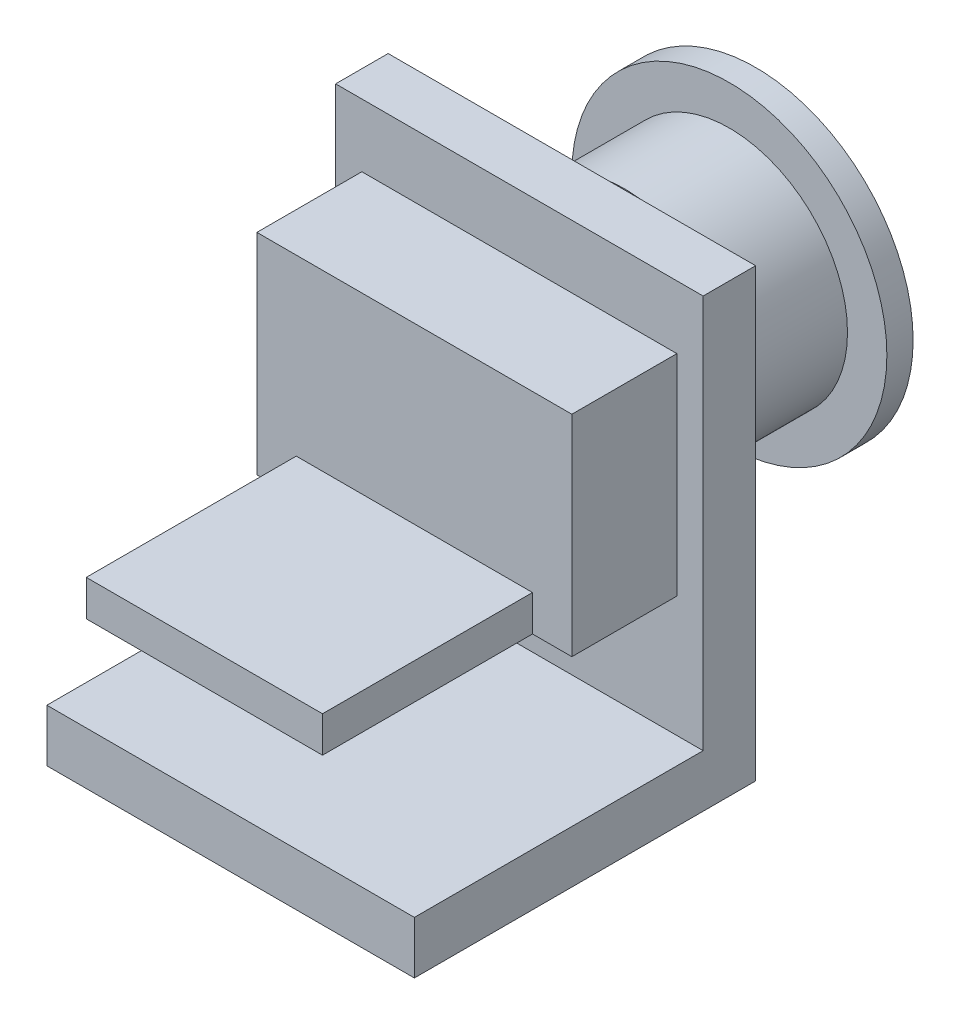
ISO-10303-21;
HEADER;
FILE_DESCRIPTION(('STEP AP214'),'2;1');
FILE_NAME('part.step','',(''),(''),'','','');
FILE_SCHEMA(('AUTOMOTIVE_DESIGN { 1 0 10303 214 1 1 1 1 }'));
ENDSEC;
DATA;
#1=APPLICATION_CONTEXT('core data for automotive mechanical design processes');
#2=APPLICATION_PROTOCOL_DEFINITION('international standard','automotive_design',2000,#1);
#3=PRODUCT_CONTEXT('',#1,'mechanical');
#4=PRODUCT('Part','Part','',(#3));
#5=PRODUCT_RELATED_PRODUCT_CATEGORY('part','',(#4));
#6=PRODUCT_DEFINITION_FORMATION('','',#4);
#7=PRODUCT_DEFINITION_CONTEXT('part definition',#1,'design');
#8=PRODUCT_DEFINITION('design','',#6,#7);
#9=PRODUCT_DEFINITION_SHAPE('','',#8);
#10=(LENGTH_UNIT() NAMED_UNIT(*) SI_UNIT(.MILLI.,.METRE.));
#11=(NAMED_UNIT(*) PLANE_ANGLE_UNIT() SI_UNIT($,.RADIAN.));
#12=(NAMED_UNIT(*) SI_UNIT($,.STERADIAN.) SOLID_ANGLE_UNIT());
#13=UNCERTAINTY_MEASURE_WITH_UNIT(LENGTH_MEASURE(1.E-05),#10,'distance_accuracy_value','');
#14=(GEOMETRIC_REPRESENTATION_CONTEXT(3) GLOBAL_UNCERTAINTY_ASSIGNED_CONTEXT((#13)) GLOBAL_UNIT_ASSIGNED_CONTEXT((#10,
#11,#12)) REPRESENTATION_CONTEXT('',''));
#15=CARTESIAN_POINT('',(0.,0.,0.));
#16=DIRECTION('',(0.,0.,1.));
#17=DIRECTION('',(1.,0.,0.));
#18=AXIS2_PLACEMENT_3D('',#15,#16,#17);
#19=CARTESIAN_POINT('',(0.,0.,41.275));
#20=DIRECTION('',(0.,0.,-1.));
#21=DIRECTION('',(-1.,0.,0.));
#22=AXIS2_PLACEMENT_3D('',#19,#20,#21);
#23=PLANE('',#22);
#24=DIRECTION('',(0.,-1.,0.));
#25=VECTOR('',#24,1.);
#26=CARTESIAN_POINT('',(-14.2875,-12.5187732823241,41.275));
#27=LINE('',#26,#25);
#28=CARTESIAN_POINT('',(-14.2875,-8.17563926273846,41.275));
#29=VERTEX_POINT('',#28);
#30=CARTESIAN_POINT('',(-14.2875,-12.5187732823241,41.275));
#31=VERTEX_POINT('',#30);
#32=EDGE_CURVE('E52',#29,#31,#27,.T.);
#33=ORIENTED_EDGE('',*,*,#32,.F.);
#34=DIRECTION('',(-1.,0.,0.));
#35=VECTOR('',#34,1.);
#36=CARTESIAN_POINT('',(-14.2875,-8.17563926273846,41.275));
#37=LINE('',#36,#35);
#38=CARTESIAN_POINT('',(14.2875,-8.17563926273846,41.275));
#39=VERTEX_POINT('',#38);
#40=EDGE_CURVE('E157',#39,#29,#37,.T.);
#41=ORIENTED_EDGE('',*,*,#40,.F.);
#42=DIRECTION('',(0.,1.,0.));
#43=VECTOR('',#42,1.);
#44=CARTESIAN_POINT('',(14.2875,-8.17563926273846,41.275));
#45=LINE('',#44,#43);
#46=CARTESIAN_POINT('',(14.2875,-12.5187732823241,41.275));
#47=VERTEX_POINT('',#46);
#48=EDGE_CURVE('E58',#47,#39,#45,.T.);
#49=ORIENTED_EDGE('',*,*,#48,.F.);
#50=DIRECTION('',(1.,0.,0.));
#51=VECTOR('',#50,1.);
#52=CARTESIAN_POINT('',(19.05,-12.5187732823241,41.275));
#53=LINE('',#52,#51);
#54=CARTESIAN_POINT('',(19.05,-12.5187732823241,41.275));
#55=VERTEX_POINT('',#54);
#56=EDGE_CURVE('E172',#47,#55,#53,.T.);
#57=ORIENTED_EDGE('',*,*,#56,.T.);
#58=DIRECTION('',(0.,1.,0.));
#59=VECTOR('',#58,1.);
#60=CARTESIAN_POINT('',(19.05,12.8812267176759,41.275));
#61=LINE('',#60,#59);
#62=CARTESIAN_POINT('',(19.05,12.8812267176759,41.275));
#63=VERTEX_POINT('',#62);
#64=EDGE_CURVE('E176',#55,#63,#61,.T.);
#65=ORIENTED_EDGE('',*,*,#64,.T.);
#66=DIRECTION('',(-1.,0.,0.));
#67=VECTOR('',#66,1.);
#68=CARTESIAN_POINT('',(-19.05,12.8812267176759,41.275));
#69=LINE('',#68,#67);
#70=CARTESIAN_POINT('',(-19.05,12.8812267176759,41.275));
#71=VERTEX_POINT('',#70);
#72=EDGE_CURVE('E178',#63,#71,#69,.T.);
#73=ORIENTED_EDGE('',*,*,#72,.T.);
#74=DIRECTION('',(0.,-1.,0.));
#75=VECTOR('',#74,1.);
#76=CARTESIAN_POINT('',(-19.05,-12.5187732823241,41.275));
#77=LINE('',#76,#75);
#78=CARTESIAN_POINT('',(-19.05,-12.5187732823241,41.275));
#79=VERTEX_POINT('',#78);
#80=EDGE_CURVE('E169',#71,#79,#77,.T.);
#81=ORIENTED_EDGE('',*,*,#80,.T.);
#82=EDGE_CURVE('E174',#79,#31,#53,.T.);
#83=ORIENTED_EDGE('',*,*,#82,.T.);
#84=EDGE_LOOP('',(#33,#41,#49,#57,#65,#73,#81,#83));
#85=FACE_BOUND('',#84,.T.);
#86=ADVANCED_FACE('F35',(#85),#23,.F.);
#87=CARTESIAN_POINT('',(0.,0.,28.575));
#88=DIRECTION('',(0.,0.,-1.));
#89=DIRECTION('',(-1.,0.,0.));
#90=AXIS2_PLACEMENT_3D('',#87,#88,#89);
#91=PLANE('',#90);
#92=DIRECTION('',(-1.,0.,0.));
#93=VECTOR('',#92,1.);
#94=CARTESIAN_POINT('',(-22.225,-27.1237732823241,28.575));
#95=LINE('',#94,#93);
#96=CARTESIAN_POINT('',(22.225,-27.1237732823241,28.575));
#97=VERTEX_POINT('',#96);
#98=CARTESIAN_POINT('',(-22.225,-27.1237732823241,28.575));
#99=VERTEX_POINT('',#98);
#100=EDGE_CURVE('E198',#97,#99,#95,.T.);
#101=ORIENTED_EDGE('',*,*,#100,.F.);
#102=DIRECTION('',(0.,1.,0.));
#103=VECTOR('',#102,1.);
#104=CARTESIAN_POINT('',(22.225,20.5012267176759,28.575));
#105=LINE('',#104,#103);
#106=CARTESIAN_POINT('',(22.225,20.5012267176759,28.575));
#107=VERTEX_POINT('',#106);
#108=EDGE_CURVE('E220',#97,#107,#105,.T.);
#109=ORIENTED_EDGE('',*,*,#108,.T.);
#110=DIRECTION('',(-1.,0.,0.));
#111=VECTOR('',#110,1.);
#112=CARTESIAN_POINT('',(-22.225,20.5012267176759,28.575));
#113=LINE('',#112,#111);
#114=CARTESIAN_POINT('',(-22.225,20.5012267176759,28.575));
#115=VERTEX_POINT('',#114);
#116=EDGE_CURVE('E223',#107,#115,#113,.T.);
#117=ORIENTED_EDGE('',*,*,#116,.T.);
#118=DIRECTION('',(0.,-1.,0.));
#119=VECTOR('',#118,1.);
#120=CARTESIAN_POINT('',(-22.225,-33.4737732823241,28.575));
#121=LINE('',#120,#119);
#122=EDGE_CURVE('E218',#115,#99,#121,.T.);
#123=ORIENTED_EDGE('',*,*,#122,.T.);
#124=EDGE_LOOP('',(#101,#109,#117,#123));
#125=FACE_BOUND('',#124,.T.);
#126=DIRECTION('',(0.,-1.,0.));
#127=VECTOR('',#126,1.);
#128=CARTESIAN_POINT('',(-19.05,-12.5187732823241,28.575));
#129=LINE('',#128,#127);
#130=CARTESIAN_POINT('',(-19.05,12.8812267176759,28.575));
#131=VERTEX_POINT('',#130);
#132=CARTESIAN_POINT('',(-19.05,-12.5187732823241,28.575));
#133=VERTEX_POINT('',#132);
#134=EDGE_CURVE('E160',#131,#133,#129,.T.);
#135=ORIENTED_EDGE('',*,*,#134,.F.);
#136=DIRECTION('',(-1.,0.,0.));
#137=VECTOR('',#136,1.);
#138=CARTESIAN_POINT('',(-19.05,12.8812267176759,28.575));
#139=LINE('',#138,#137);
#140=CARTESIAN_POINT('',(19.05,12.8812267176759,28.575));
#141=VERTEX_POINT('',#140);
#142=EDGE_CURVE('E173',#141,#131,#139,.T.);
#143=ORIENTED_EDGE('',*,*,#142,.F.);
#144=DIRECTION('',(0.,1.,0.));
#145=VECTOR('',#144,1.);
#146=CARTESIAN_POINT('',(19.05,12.8812267176759,28.575));
#147=LINE('',#146,#145);
#148=CARTESIAN_POINT('',(19.05,-12.5187732823241,28.575));
#149=VERTEX_POINT('',#148);
#150=EDGE_CURVE('E182',#149,#141,#147,.T.);
#151=ORIENTED_EDGE('',*,*,#150,.F.);
#152=DIRECTION('',(1.,0.,0.));
#153=VECTOR('',#152,1.);
#154=CARTESIAN_POINT('',(19.05,-12.5187732823241,28.575));
#155=LINE('',#154,#153);
#156=EDGE_CURVE('E163',#133,#149,#155,.T.);
#157=ORIENTED_EDGE('',*,*,#156,.F.);
#158=EDGE_LOOP('',(#135,#143,#151,#157));
#159=FACE_BOUND('',#158,.T.);
#160=ADVANCED_FACE('F273',(#125,#159),#91,.F.);
#161=CARTESIAN_POINT('',(0.,0.,3.175));
#162=DIRECTION('',(0.,0.,-1.));
#163=DIRECTION('',(-1.,0.,0.));
#164=AXIS2_PLACEMENT_3D('',#161,#162,#163);
#165=CYLINDRICAL_SURFACE('',#164,19.05);
#166=CARTESIAN_POINT('',(0.,0.,3.175));
#167=DIRECTION('',(0.,0.,1.));
#168=DIRECTION('',(1.,0.,0.));
#169=AXIS2_PLACEMENT_3D('',#166,#167,#168);
#170=CIRCLE('',#169,19.05);
#171=CARTESIAN_POINT('',(19.05,0.,3.175));
#172=VERTEX_POINT('',#171);
#173=EDGE_CURVE('E251',#172,#172,#170,.T.);
#174=ORIENTED_EDGE('',*,*,#173,.F.);
#175=EDGE_LOOP('',(#174));
#176=FACE_BOUND('',#175,.T.);
#177=CARTESIAN_POINT('',(0.,0.,0.));
#178=DIRECTION('',(0.,0.,1.));
#179=DIRECTION('',(1.,0.,0.));
#180=AXIS2_PLACEMENT_3D('',#177,#178,#179);
#181=CIRCLE('',#180,19.05);
#182=CARTESIAN_POINT('',(19.05,0.,0.));
#183=VERTEX_POINT('',#182);
#184=EDGE_CURVE('E39',#183,#183,#181,.T.);
#185=ORIENTED_EDGE('',*,*,#184,.T.);
#186=EDGE_LOOP('',(#185));
#187=FACE_BOUND('',#186,.T.);
#188=ADVANCED_FACE('F37',(#176,#187),#165,.T.);
#189=CARTESIAN_POINT('',(0.,0.,3.175));
#190=DIRECTION('',(0.,0.,1.));
#191=DIRECTION('',(1.,0.,0.));
#192=AXIS2_PLACEMENT_3D('',#189,#190,#191);
#193=PLANE('',#192);
#194=CARTESIAN_POINT('',(0.,0.,3.175));
#195=DIRECTION('',(0.,0.,1.));
#196=DIRECTION('',(1.,0.,0.));
#197=AXIS2_PLACEMENT_3D('',#194,#195,#196);
#198=CIRCLE('',#197,14.2875);
#199=CARTESIAN_POINT('',(14.2875,0.,3.175));
#200=VERTEX_POINT('',#199);
#201=EDGE_CURVE('E44',#200,#200,#198,.T.);
#202=ORIENTED_EDGE('',*,*,#201,.F.);
#203=EDGE_LOOP('',(#202));
#204=FACE_BOUND('',#203,.T.);
#205=ORIENTED_EDGE('',*,*,#173,.T.);
#206=EDGE_LOOP('',(#205));
#207=FACE_BOUND('',#206,.T.);
#208=ADVANCED_FACE('F262',(#204,#207),#193,.T.);
#209=CARTESIAN_POINT('',(0.,0.,0.));
#210=DIRECTION('',(0.,0.,1.));
#211=DIRECTION('',(1.,0.,0.));
#212=AXIS2_PLACEMENT_3D('',#209,#210,#211);
#213=PLANE('',#212);
#214=ORIENTED_EDGE('',*,*,#184,.F.);
#215=EDGE_LOOP('',(#214));
#216=FACE_BOUND('',#215,.T.);
#217=ADVANCED_FACE('F259',(#216),#213,.F.);
#218=CARTESIAN_POINT('',(0.,0.,15.875));
#219=DIRECTION('',(0.,0.,-1.));
#220=DIRECTION('',(-1.,0.,0.));
#221=AXIS2_PLACEMENT_3D('',#218,#219,#220);
#222=CYLINDRICAL_SURFACE('',#221,14.2875);
#223=CARTESIAN_POINT('',(0.,0.,15.875));
#224=DIRECTION('',(0.,0.,1.));
#225=DIRECTION('',(1.,0.,0.));
#226=AXIS2_PLACEMENT_3D('',#223,#224,#225);
#227=CIRCLE('',#226,14.2875);
#228=CARTESIAN_POINT('',(14.2875,0.,15.875));
#229=VERTEX_POINT('',#228);
#230=EDGE_CURVE('E246',#229,#229,#227,.T.);
#231=ORIENTED_EDGE('',*,*,#230,.F.);
#232=EDGE_LOOP('',(#231));
#233=FACE_BOUND('',#232,.T.);
#234=ORIENTED_EDGE('',*,*,#201,.T.);
#235=EDGE_LOOP('',(#234));
#236=FACE_BOUND('',#235,.T.);
#237=ADVANCED_FACE('F261',(#233,#236),#222,.T.);
#238=CARTESIAN_POINT('',(0.,0.,15.875));
#239=DIRECTION('',(0.,0.,1.));
#240=DIRECTION('',(1.,0.,0.));
#241=AXIS2_PLACEMENT_3D('',#238,#239,#240);
#242=PLANE('',#241);
#243=CARTESIAN_POINT('',(0.,0.,15.875));
#244=DIRECTION('',(0.,0.,1.));
#245=DIRECTION('',(1.,0.,0.));
#246=AXIS2_PLACEMENT_3D('',#243,#244,#245);
#247=CIRCLE('',#246,12.7);
#248=CARTESIAN_POINT('',(12.7,0.,15.875));
#249=VERTEX_POINT('',#248);
#250=EDGE_CURVE('E11',#249,#249,#247,.T.);
#251=ORIENTED_EDGE('',*,*,#250,.F.);
#252=EDGE_LOOP('',(#251));
#253=FACE_BOUND('',#252,.T.);
#254=ORIENTED_EDGE('',*,*,#230,.T.);
#255=EDGE_LOOP('',(#254));
#256=FACE_BOUND('',#255,.T.);
#257=ADVANCED_FACE('F267',(#253,#256),#242,.T.);
#258=CARTESIAN_POINT('',(0.,0.,22.225));
#259=DIRECTION('',(0.,0.,-1.));
#260=DIRECTION('',(-1.,0.,0.));
#261=AXIS2_PLACEMENT_3D('',#258,#259,#260);
#262=CYLINDRICAL_SURFACE('',#261,12.7);
#263=CARTESIAN_POINT('',(0.,0.,22.225));
#264=DIRECTION('',(0.,0.,1.));
#265=DIRECTION('',(1.,0.,0.));
#266=AXIS2_PLACEMENT_3D('',#263,#264,#265);
#267=CIRCLE('',#266,12.7);
#268=CARTESIAN_POINT('',(12.7,0.,22.225));
#269=VERTEX_POINT('',#268);
#270=EDGE_CURVE('E244',#269,#269,#267,.T.);
#271=ORIENTED_EDGE('',*,*,#270,.F.);
#272=EDGE_LOOP('',(#271));
#273=FACE_BOUND('',#272,.T.);
#274=ORIENTED_EDGE('',*,*,#250,.T.);
#275=EDGE_LOOP('',(#274));
#276=FACE_BOUND('',#275,.T.);
#277=ADVANCED_FACE('F324',(#273,#276),#262,.T.);
#278=CARTESIAN_POINT('',(-22.225,-33.4737732823241,28.575));
#279=DIRECTION('',(1.,0.,0.));
#280=DIRECTION('',(0.,1.,0.));
#281=AXIS2_PLACEMENT_3D('',#278,#279,#280);
#282=PLANE('',#281);
#283=DIRECTION('',(0.,-1.,0.));
#284=VECTOR('',#283,1.);
#285=CARTESIAN_POINT('',(-22.225,-33.4737732823241,22.225));
#286=LINE('',#285,#284);
#287=CARTESIAN_POINT('',(-22.225,20.5012267176759,22.225));
#288=VERTEX_POINT('',#287);
#289=CARTESIAN_POINT('',(-22.225,-33.4737732823241,22.225));
#290=VERTEX_POINT('',#289);
#291=EDGE_CURVE('E217',#288,#290,#286,.T.);
#292=ORIENTED_EDGE('',*,*,#291,.T.);
#293=DIRECTION('',(0.,0.,-1.));
#294=VECTOR('',#293,1.);
#295=CARTESIAN_POINT('',(-22.225,-33.4737732823241,28.575));
#296=LINE('',#295,#294);
#297=CARTESIAN_POINT('',(-22.225,-33.4737732823241,63.5));
#298=VERTEX_POINT('',#297);
#299=EDGE_CURVE('E241',#298,#290,#296,.T.);
#300=ORIENTED_EDGE('',*,*,#299,.F.);
#301=DIRECTION('',(0.,-1.,0.));
#302=VECTOR('',#301,1.);
#303=CARTESIAN_POINT('',(-22.225,-33.4737732823241,63.5));
#304=LINE('',#303,#302);
#305=CARTESIAN_POINT('',(-22.225,-27.1237732823241,63.5));
#306=VERTEX_POINT('',#305);
#307=EDGE_CURVE('E199',#306,#298,#304,.T.);
#308=ORIENTED_EDGE('',*,*,#307,.F.);
#309=DIRECTION('',(0.,0.,-1.));
#310=VECTOR('',#309,1.);
#311=CARTESIAN_POINT('',(-22.225,-27.1237732823241,63.5));
#312=LINE('',#311,#310);
#313=EDGE_CURVE('E209',#306,#99,#312,.T.);
#314=ORIENTED_EDGE('',*,*,#313,.T.);
#315=ORIENTED_EDGE('',*,*,#122,.F.);
#316=DIRECTION('',(0.,0.,-1.));
#317=VECTOR('',#316,1.);
#318=CARTESIAN_POINT('',(-22.225,20.5012267176759,28.575));
#319=LINE('',#318,#317);
#320=EDGE_CURVE('E225',#115,#288,#319,.T.);
#321=ORIENTED_EDGE('',*,*,#320,.T.);
#322=EDGE_LOOP('',(#292,#300,#308,#314,#315,#321));
#323=FACE_BOUND('',#322,.T.);
#324=ADVANCED_FACE('F320',(#323),#282,.F.);
#325=CARTESIAN_POINT('',(22.225,-33.4737732823241,28.575));
#326=DIRECTION('',(0.,1.,0.));
#327=DIRECTION('',(0.,0.,1.));
#328=AXIS2_PLACEMENT_3D('',#325,#326,#327);
#329=PLANE('',#328);
#330=DIRECTION('',(1.,0.,0.));
#331=VECTOR('',#330,1.);
#332=CARTESIAN_POINT('',(22.225,-33.4737732823241,22.225));
#333=LINE('',#332,#331);
#334=CARTESIAN_POINT('',(22.225,-33.4737732823241,22.225));
#335=VERTEX_POINT('',#334);
#336=EDGE_CURVE('E228',#290,#335,#333,.T.);
#337=ORIENTED_EDGE('',*,*,#336,.T.);
#338=DIRECTION('',(0.,0.,-1.));
#339=VECTOR('',#338,1.);
#340=CARTESIAN_POINT('',(22.225,-33.4737732823241,28.575));
#341=LINE('',#340,#339);
#342=CARTESIAN_POINT('',(22.225,-33.4737732823241,63.5));
#343=VERTEX_POINT('',#342);
#344=EDGE_CURVE('E238',#343,#335,#341,.T.);
#345=ORIENTED_EDGE('',*,*,#344,.F.);
#346=DIRECTION('',(1.,0.,0.));
#347=VECTOR('',#346,1.);
#348=CARTESIAN_POINT('',(22.225,-33.4737732823241,63.5));
#349=LINE('',#348,#347);
#350=EDGE_CURVE('E202',#298,#343,#349,.T.);
#351=ORIENTED_EDGE('',*,*,#350,.F.);
#352=ORIENTED_EDGE('',*,*,#299,.T.);
#353=EDGE_LOOP('',(#337,#345,#351,#352));
#354=FACE_BOUND('',#353,.T.);
#355=ADVANCED_FACE('F316',(#354),#329,.F.);
#356=CARTESIAN_POINT('',(22.225,20.5012267176759,28.575));
#357=DIRECTION('',(-1.,0.,0.));
#358=DIRECTION('',(0.,-1.,0.));
#359=AXIS2_PLACEMENT_3D('',#356,#357,#358);
#360=PLANE('',#359);
#361=DIRECTION('',(0.,1.,0.));
#362=VECTOR('',#361,1.);
#363=CARTESIAN_POINT('',(22.225,20.5012267176759,22.225));
#364=LINE('',#363,#362);
#365=CARTESIAN_POINT('',(22.225,20.5012267176759,22.225));
#366=VERTEX_POINT('',#365);
#367=EDGE_CURVE('E230',#335,#366,#364,.T.);
#368=ORIENTED_EDGE('',*,*,#367,.T.);
#369=DIRECTION('',(0.,0.,-1.));
#370=VECTOR('',#369,1.);
#371=CARTESIAN_POINT('',(22.225,20.5012267176759,28.575));
#372=LINE('',#371,#370);
#373=EDGE_CURVE('E235',#107,#366,#372,.T.);
#374=ORIENTED_EDGE('',*,*,#373,.F.);
#375=ORIENTED_EDGE('',*,*,#108,.F.);
#376=DIRECTION('',(0.,0.,-1.));
#377=VECTOR('',#376,1.);
#378=CARTESIAN_POINT('',(22.225,-27.1237732823241,63.5));
#379=LINE('',#378,#377);
#380=CARTESIAN_POINT('',(22.225,-27.1237732823241,63.5));
#381=VERTEX_POINT('',#380);
#382=EDGE_CURVE('E214',#381,#97,#379,.T.);
#383=ORIENTED_EDGE('',*,*,#382,.F.);
#384=DIRECTION('',(0.,1.,0.));
#385=VECTOR('',#384,1.);
#386=CARTESIAN_POINT('',(22.225,-27.1237732823241,63.5));
#387=LINE('',#386,#385);
#388=EDGE_CURVE('E205',#343,#381,#387,.T.);
#389=ORIENTED_EDGE('',*,*,#388,.F.);
#390=ORIENTED_EDGE('',*,*,#344,.T.);
#391=EDGE_LOOP('',(#368,#374,#375,#383,#389,#390));
#392=FACE_BOUND('',#391,.T.);
#393=ADVANCED_FACE('F312',(#392),#360,.F.);
#394=CARTESIAN_POINT('',(-22.225,20.5012267176759,28.575));
#395=DIRECTION('',(0.,-1.,0.));
#396=DIRECTION('',(0.,0.,-1.));
#397=AXIS2_PLACEMENT_3D('',#394,#395,#396);
#398=PLANE('',#397);
#399=DIRECTION('',(-1.,0.,0.));
#400=VECTOR('',#399,1.);
#401=CARTESIAN_POINT('',(-22.225,20.5012267176759,22.225));
#402=LINE('',#401,#400);
#403=EDGE_CURVE('E221',#366,#288,#402,.T.);
#404=ORIENTED_EDGE('',*,*,#403,.T.);
#405=ORIENTED_EDGE('',*,*,#320,.F.);
#406=ORIENTED_EDGE('',*,*,#116,.F.);
#407=ORIENTED_EDGE('',*,*,#373,.T.);
#408=EDGE_LOOP('',(#404,#405,#406,#407));
#409=FACE_BOUND('',#408,.T.);
#410=ADVANCED_FACE('F308',(#409),#398,.F.);
#411=CARTESIAN_POINT('',(0.,0.,22.225));
#412=DIRECTION('',(0.,0.,-1.));
#413=DIRECTION('',(-1.,0.,0.));
#414=AXIS2_PLACEMENT_3D('',#411,#412,#413);
#415=PLANE('',#414);
#416=ORIENTED_EDGE('',*,*,#270,.T.);
#417=EDGE_LOOP('',(#416));
#418=FACE_BOUND('',#417,.T.);
#419=ORIENTED_EDGE('',*,*,#291,.F.);
#420=ORIENTED_EDGE('',*,*,#403,.F.);
#421=ORIENTED_EDGE('',*,*,#367,.F.);
#422=ORIENTED_EDGE('',*,*,#336,.F.);
#423=EDGE_LOOP('',(#419,#420,#421,#422));
#424=FACE_BOUND('',#423,.T.);
#425=ADVANCED_FACE('F303',(#418,#424),#415,.T.);
#426=CARTESIAN_POINT('',(-22.225,-27.1237732823241,63.5));
#427=DIRECTION('',(0.,-1.,0.));
#428=DIRECTION('',(0.,0.,-1.));
#429=AXIS2_PLACEMENT_3D('',#426,#427,#428);
#430=PLANE('',#429);
#431=ORIENTED_EDGE('',*,*,#100,.T.);
#432=ORIENTED_EDGE('',*,*,#313,.F.);
#433=DIRECTION('',(-1.,0.,0.));
#434=VECTOR('',#433,1.);
#435=CARTESIAN_POINT('',(-22.225,-27.1237732823241,63.5));
#436=LINE('',#435,#434);
#437=EDGE_CURVE('E207',#381,#306,#436,.T.);
#438=ORIENTED_EDGE('',*,*,#437,.F.);
#439=ORIENTED_EDGE('',*,*,#382,.T.);
#440=EDGE_LOOP('',(#431,#432,#438,#439));
#441=FACE_BOUND('',#440,.T.);
#442=ADVANCED_FACE('F300',(#441),#430,.F.);
#443=CARTESIAN_POINT('',(0.,0.,63.5));
#444=DIRECTION('',(0.,0.,-1.));
#445=DIRECTION('',(-1.,0.,0.));
#446=AXIS2_PLACEMENT_3D('',#443,#444,#445);
#447=PLANE('',#446);
#448=ORIENTED_EDGE('',*,*,#307,.T.);
#449=ORIENTED_EDGE('',*,*,#350,.T.);
#450=ORIENTED_EDGE('',*,*,#388,.T.);
#451=ORIENTED_EDGE('',*,*,#437,.T.);
#452=EDGE_LOOP('',(#448,#449,#450,#451));
#453=FACE_BOUND('',#452,.T.);
#454=ADVANCED_FACE('F296',(#453),#447,.F.);
#455=CARTESIAN_POINT('',(-19.05,-12.5187732823241,41.275));
#456=DIRECTION('',(1.,0.,0.));
#457=DIRECTION('',(0.,1.,0.));
#458=AXIS2_PLACEMENT_3D('',#455,#456,#457);
#459=PLANE('',#458);
#460=ORIENTED_EDGE('',*,*,#134,.T.);
#461=DIRECTION('',(0.,0.,-1.));
#462=VECTOR('',#461,1.);
#463=CARTESIAN_POINT('',(-19.05,-12.5187732823241,41.275));
#464=LINE('',#463,#462);
#465=EDGE_CURVE('E195',#79,#133,#464,.T.);
#466=ORIENTED_EDGE('',*,*,#465,.F.);
#467=ORIENTED_EDGE('',*,*,#80,.F.);
#468=DIRECTION('',(0.,0.,-1.));
#469=VECTOR('',#468,1.);
#470=CARTESIAN_POINT('',(-19.05,12.8812267176759,41.275));
#471=LINE('',#470,#469);
#472=EDGE_CURVE('E179',#71,#131,#471,.T.);
#473=ORIENTED_EDGE('',*,*,#472,.T.);
#474=EDGE_LOOP('',(#460,#466,#467,#473));
#475=FACE_BOUND('',#474,.T.);
#476=ADVANCED_FACE('F293',(#475),#459,.F.);
#477=CARTESIAN_POINT('',(19.05,-12.5187732823241,41.275));
#478=DIRECTION('',(0.,1.,0.));
#479=DIRECTION('',(-1.,0.,0.));
#480=AXIS2_PLACEMENT_3D('',#477,#478,#479);
#481=PLANE('',#480);
#482=ORIENTED_EDGE('',*,*,#156,.T.);
#483=DIRECTION('',(0.,0.,-1.));
#484=VECTOR('',#483,1.);
#485=CARTESIAN_POINT('',(19.05,-12.5187732823241,41.275));
#486=LINE('',#485,#484);
#487=EDGE_CURVE('E192',#55,#149,#486,.T.);
#488=ORIENTED_EDGE('',*,*,#487,.F.);
#489=ORIENTED_EDGE('',*,*,#56,.F.);
#490=DIRECTION('',(0.,0.,-1.));
#491=VECTOR('',#490,1.);
#492=CARTESIAN_POINT('',(14.2875,-12.5187732823241,66.675));
#493=LINE('',#492,#491);
#494=CARTESIAN_POINT('',(14.2875,-12.5187732823241,66.675));
#495=VERTEX_POINT('',#494);
#496=EDGE_CURVE('E144',#495,#47,#493,.T.);
#497=ORIENTED_EDGE('',*,*,#496,.F.);
#498=DIRECTION('',(1.,0.,0.));
#499=VECTOR('',#498,1.);
#500=CARTESIAN_POINT('',(14.2875,-12.5187732823241,66.675));
#501=LINE('',#500,#499);
#502=CARTESIAN_POINT('',(-14.2875,-12.5187732823241,66.675));
#503=VERTEX_POINT('',#502);
#504=EDGE_CURVE('E137',#503,#495,#501,.T.);
#505=ORIENTED_EDGE('',*,*,#504,.F.);
#506=DIRECTION('',(0.,0.,-1.));
#507=VECTOR('',#506,1.);
#508=CARTESIAN_POINT('',(-14.2875,-12.5187732823241,66.675));
#509=LINE('',#508,#507);
#510=EDGE_CURVE('E142',#503,#31,#509,.T.);
#511=ORIENTED_EDGE('',*,*,#510,.T.);
#512=ORIENTED_EDGE('',*,*,#82,.F.);
#513=ORIENTED_EDGE('',*,*,#465,.T.);
#514=EDGE_LOOP('',(#482,#488,#489,#497,#505,#511,#512,#513));
#515=FACE_BOUND('',#514,.T.);
#516=ADVANCED_FACE('F140',(#515),#481,.F.);
#517=CARTESIAN_POINT('',(19.05,12.8812267176759,41.275));
#518=DIRECTION('',(-1.,0.,0.));
#519=DIRECTION('',(0.,0.,1.));
#520=AXIS2_PLACEMENT_3D('',#517,#518,#519);
#521=PLANE('',#520);
#522=ORIENTED_EDGE('',*,*,#150,.T.);
#523=DIRECTION('',(0.,0.,-1.));
#524=VECTOR('',#523,1.);
#525=CARTESIAN_POINT('',(19.05,12.8812267176759,41.275));
#526=LINE('',#525,#524);
#527=EDGE_CURVE('E189',#63,#141,#526,.T.);
#528=ORIENTED_EDGE('',*,*,#527,.F.);
#529=ORIENTED_EDGE('',*,*,#64,.F.);
#530=ORIENTED_EDGE('',*,*,#487,.T.);
#531=EDGE_LOOP('',(#522,#528,#529,#530));
#532=FACE_BOUND('',#531,.T.);
#533=ADVANCED_FACE('F286',(#532),#521,.F.);
#534=CARTESIAN_POINT('',(-19.05,12.8812267176759,41.275));
#535=DIRECTION('',(0.,-1.,0.));
#536=DIRECTION('',(1.,0.,0.));
#537=AXIS2_PLACEMENT_3D('',#534,#535,#536);
#538=PLANE('',#537);
#539=ORIENTED_EDGE('',*,*,#142,.T.);
#540=ORIENTED_EDGE('',*,*,#472,.F.);
#541=ORIENTED_EDGE('',*,*,#72,.F.);
#542=ORIENTED_EDGE('',*,*,#527,.T.);
#543=EDGE_LOOP('',(#539,#540,#541,#542));
#544=FACE_BOUND('',#543,.T.);
#545=ADVANCED_FACE('F283',(#544),#538,.F.);
#546=CARTESIAN_POINT('',(-14.2875,-12.5187732823241,66.675));
#547=DIRECTION('',(1.,0.,0.));
#548=DIRECTION('',(0.,1.,0.));
#549=AXIS2_PLACEMENT_3D('',#546,#547,#548);
#550=PLANE('',#549);
#551=ORIENTED_EDGE('',*,*,#32,.T.);
#552=ORIENTED_EDGE('',*,*,#510,.F.);
#553=DIRECTION('',(0.,-1.,0.));
#554=VECTOR('',#553,1.);
#555=CARTESIAN_POINT('',(-14.2875,-12.5187732823241,66.675));
#556=LINE('',#555,#554);
#557=CARTESIAN_POINT('',(-14.2875,-8.17563926273846,66.675));
#558=VERTEX_POINT('',#557);
#559=EDGE_CURVE('E148',#558,#503,#556,.T.);
#560=ORIENTED_EDGE('',*,*,#559,.F.);
#561=DIRECTION('',(0.,0.,-1.));
#562=VECTOR('',#561,1.);
#563=CARTESIAN_POINT('',(-14.2875,-8.17563926273846,66.675));
#564=LINE('',#563,#562);
#565=EDGE_CURVE('E496',#558,#29,#564,.T.);
#566=ORIENTED_EDGE('',*,*,#565,.T.);
#567=EDGE_LOOP('',(#551,#552,#560,#566));
#568=FACE_BOUND('',#567,.T.);
#569=ADVANCED_FACE('F159',(#568),#550,.F.);
#570=CARTESIAN_POINT('',(14.2875,-8.17563926273846,66.675));
#571=DIRECTION('',(-1.,0.,0.));
#572=DIRECTION('',(0.,0.,1.));
#573=AXIS2_PLACEMENT_3D('',#570,#571,#572);
#574=PLANE('',#573);
#575=ORIENTED_EDGE('',*,*,#48,.T.);
#576=DIRECTION('',(0.,0.,-1.));
#577=VECTOR('',#576,1.);
#578=CARTESIAN_POINT('',(14.2875,-8.17563926273846,66.675));
#579=LINE('',#578,#577);
#580=CARTESIAN_POINT('',(14.2875,-8.17563926273846,66.675));
#581=VERTEX_POINT('',#580);
#582=EDGE_CURVE('E165',#581,#39,#579,.T.);
#583=ORIENTED_EDGE('',*,*,#582,.F.);
#584=DIRECTION('',(0.,1.,0.));
#585=VECTOR('',#584,1.);
#586=CARTESIAN_POINT('',(14.2875,-8.17563926273846,66.675));
#587=LINE('',#586,#585);
#588=EDGE_CURVE('E147',#495,#581,#587,.T.);
#589=ORIENTED_EDGE('',*,*,#588,.F.);
#590=ORIENTED_EDGE('',*,*,#496,.T.);
#591=EDGE_LOOP('',(#575,#583,#589,#590));
#592=FACE_BOUND('',#591,.T.);
#593=ADVANCED_FACE('F396',(#592),#574,.F.);
#594=CARTESIAN_POINT('',(-14.2875,-8.17563926273846,66.675));
#595=DIRECTION('',(0.,-1.,0.));
#596=DIRECTION('',(0.,0.,-1.));
#597=AXIS2_PLACEMENT_3D('',#594,#595,#596);
#598=PLANE('',#597);
#599=ORIENTED_EDGE('',*,*,#40,.T.);
#600=ORIENTED_EDGE('',*,*,#565,.F.);
#601=DIRECTION('',(-1.,0.,0.));
#602=VECTOR('',#601,1.);
#603=CARTESIAN_POINT('',(-14.2875,-8.17563926273846,66.675));
#604=LINE('',#603,#602);
#605=EDGE_CURVE('E153',#581,#558,#604,.T.);
#606=ORIENTED_EDGE('',*,*,#605,.F.);
#607=ORIENTED_EDGE('',*,*,#582,.T.);
#608=EDGE_LOOP('',(#599,#600,#606,#607));
#609=FACE_BOUND('',#608,.T.);
#610=ADVANCED_FACE('F402',(#609),#598,.F.);
#611=CARTESIAN_POINT('',(0.,0.,66.675));
#612=DIRECTION('',(0.,0.,-1.));
#613=DIRECTION('',(-1.,0.,0.));
#614=AXIS2_PLACEMENT_3D('',#611,#612,#613);
#615=PLANE('',#614);
#616=ORIENTED_EDGE('',*,*,#559,.T.);
#617=ORIENTED_EDGE('',*,*,#504,.T.);
#618=ORIENTED_EDGE('',*,*,#588,.T.);
#619=ORIENTED_EDGE('',*,*,#605,.T.);
#620=EDGE_LOOP('',(#616,#617,#618,#619));
#621=FACE_BOUND('',#620,.T.);
#622=ADVANCED_FACE('F151',(#621),#615,.F.);
#623=CLOSED_SHELL('',(#86,#160,#188,#208,#217,#237,#257,#277,#324,#355,#393,#410,#425,#442,#454,
#476,#516,#533,#545,#569,#593,#610,#622));
#624=MANIFOLD_SOLID_BREP('B2',#623);
#625=ADVANCED_BREP_SHAPE_REPRESENTATION('',(#18,#624),#14);
#626=SHAPE_DEFINITION_REPRESENTATION(#9,#625);
ENDSEC;
END-ISO-10303-21;
